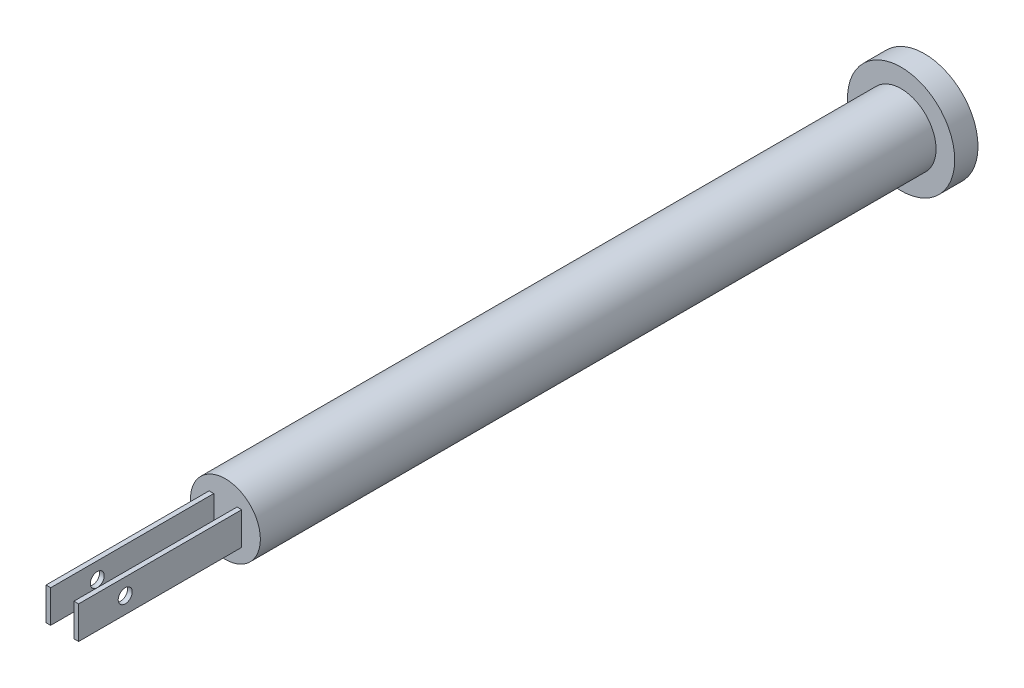
ISO-10303-21;
HEADER;
FILE_DESCRIPTION(('STEP AP214'),'2;1');
FILE_NAME('part.step','',(''),(''),'','','');
FILE_SCHEMA(('AUTOMOTIVE_DESIGN { 1 0 10303 214 1 1 1 1 }'));
ENDSEC;
DATA;
#1=APPLICATION_CONTEXT('core data for automotive mechanical design processes');
#2=APPLICATION_PROTOCOL_DEFINITION('international standard','automotive_design',2000,#1);
#3=PRODUCT_CONTEXT('',#1,'mechanical');
#4=PRODUCT('Part','Part','',(#3));
#5=PRODUCT_RELATED_PRODUCT_CATEGORY('part','',(#4));
#6=PRODUCT_DEFINITION_FORMATION('','',#4);
#7=PRODUCT_DEFINITION_CONTEXT('part definition',#1,'design');
#8=PRODUCT_DEFINITION('design','',#6,#7);
#9=PRODUCT_DEFINITION_SHAPE('','',#8);
#10=(LENGTH_UNIT() NAMED_UNIT(*) SI_UNIT(.MILLI.,.METRE.));
#11=(NAMED_UNIT(*) PLANE_ANGLE_UNIT() SI_UNIT($,.RADIAN.));
#12=(NAMED_UNIT(*) SI_UNIT($,.STERADIAN.) SOLID_ANGLE_UNIT());
#13=UNCERTAINTY_MEASURE_WITH_UNIT(LENGTH_MEASURE(1.E-05),#10,'distance_accuracy_value','');
#14=(GEOMETRIC_REPRESENTATION_CONTEXT(3) GLOBAL_UNCERTAINTY_ASSIGNED_CONTEXT((#13)) GLOBAL_UNIT_ASSIGNED_CONTEXT((#10,
#11,#12)) REPRESENTATION_CONTEXT('',''));
#15=CARTESIAN_POINT('',(0.,0.,0.));
#16=DIRECTION('',(0.,0.,1.));
#17=DIRECTION('',(1.,0.,0.));
#18=AXIS2_PLACEMENT_3D('',#15,#16,#17);
#19=CARTESIAN_POINT('',(-3.5,3.5,185.));
#20=DIRECTION('',(0.,-1.,0.));
#21=DIRECTION('',(0.,0.,-1.));
#22=AXIS2_PLACEMENT_3D('',#19,#20,#21);
#23=PLANE('',#22);
#24=DIRECTION('',(-1.,0.,0.));
#25=VECTOR('',#24,1.);
#26=CARTESIAN_POINT('',(-3.5,3.5,185.));
#27=LINE('',#26,#25);
#28=CARTESIAN_POINT('',(-2.5,3.5,185.));
#29=VERTEX_POINT('',#28);
#30=CARTESIAN_POINT('',(-3.5,3.5,185.));
#31=VERTEX_POINT('',#30);
#32=EDGE_CURVE('E116',#29,#31,#27,.T.);
#33=ORIENTED_EDGE('',*,*,#32,.F.);
#34=DIRECTION('',(0.,0.,1.));
#35=VECTOR('',#34,1.);
#36=CARTESIAN_POINT('',(-2.50000000000001,3.5,150.));
#37=LINE('',#36,#35);
#38=CARTESIAN_POINT('',(-2.50000000000001,3.5,150.));
#39=VERTEX_POINT('',#38);
#40=EDGE_CURVE('E102',#39,#29,#37,.T.);
#41=ORIENTED_EDGE('',*,*,#40,.F.);
#42=DIRECTION('',(-1.,0.,0.));
#43=VECTOR('',#42,1.);
#44=CARTESIAN_POINT('',(-3.5,3.5,150.));
#45=LINE('',#44,#43);
#46=CARTESIAN_POINT('',(-3.5,3.5,150.));
#47=VERTEX_POINT('',#46);
#48=EDGE_CURVE('E139',#39,#47,#45,.T.);
#49=ORIENTED_EDGE('',*,*,#48,.T.);
#50=DIRECTION('',(0.,0.,-1.));
#51=VECTOR('',#50,1.);
#52=CARTESIAN_POINT('',(-3.5,3.5,185.));
#53=LINE('',#52,#51);
#54=EDGE_CURVE('E120',#31,#47,#53,.T.);
#55=ORIENTED_EDGE('',*,*,#54,.F.);
#56=EDGE_LOOP('',(#33,#41,#49,#55));
#57=FACE_BOUND('',#56,.T.);
#58=ADVANCED_FACE('F35',(#57),#23,.F.);
#59=CARTESIAN_POINT('',(-3.5,-3.5,185.));
#60=DIRECTION('',(0.,1.,0.));
#61=DIRECTION('',(0.,0.,1.));
#62=AXIS2_PLACEMENT_3D('',#59,#60,#61);
#63=PLANE('',#62);
#64=DIRECTION('',(1.,0.,0.));
#65=VECTOR('',#64,1.);
#66=CARTESIAN_POINT('',(-3.5,-3.5,150.));
#67=LINE('',#66,#65);
#68=CARTESIAN_POINT('',(-3.5,-3.5,150.));
#69=VERTEX_POINT('',#68);
#70=CARTESIAN_POINT('',(-2.50000000000001,-3.5,150.));
#71=VERTEX_POINT('',#70);
#72=EDGE_CURVE('E128',#69,#71,#67,.T.);
#73=ORIENTED_EDGE('',*,*,#72,.T.);
#74=DIRECTION('',(0.,0.,1.));
#75=VECTOR('',#74,1.);
#76=CARTESIAN_POINT('',(-2.5,-3.5,185.));
#77=LINE('',#76,#75);
#78=CARTESIAN_POINT('',(-2.5,-3.5,185.));
#79=VERTEX_POINT('',#78);
#80=EDGE_CURVE('E140',#71,#79,#77,.T.);
#81=ORIENTED_EDGE('',*,*,#80,.T.);
#82=DIRECTION('',(1.,0.,0.));
#83=VECTOR('',#82,1.);
#84=CARTESIAN_POINT('',(-3.5,-3.5,185.));
#85=LINE('',#84,#83);
#86=CARTESIAN_POINT('',(-3.5,-3.5,185.));
#87=VERTEX_POINT('',#86);
#88=EDGE_CURVE('E118',#87,#79,#85,.T.);
#89=ORIENTED_EDGE('',*,*,#88,.F.);
#90=DIRECTION('',(0.,0.,-1.));
#91=VECTOR('',#90,1.);
#92=CARTESIAN_POINT('',(-3.5,-3.5,185.));
#93=LINE('',#92,#91);
#94=EDGE_CURVE('E59',#87,#69,#93,.T.);
#95=ORIENTED_EDGE('',*,*,#94,.T.);
#96=EDGE_LOOP('',(#73,#81,#89,#95));
#97=FACE_BOUND('',#96,.T.);
#98=ADVANCED_FACE('F189',(#97),#63,.F.);
#99=CARTESIAN_POINT('',(0.,0.,185.));
#100=DIRECTION('',(0.,0.,-1.));
#101=DIRECTION('',(-1.,0.,0.));
#102=AXIS2_PLACEMENT_3D('',#99,#100,#101);
#103=PLANE('',#102);
#104=ORIENTED_EDGE('',*,*,#88,.T.);
#105=DIRECTION('',(0.,1.,0.));
#106=VECTOR('',#105,1.);
#107=CARTESIAN_POINT('',(-2.5,0.,185.));
#108=LINE('',#107,#106);
#109=EDGE_CURVE('E11',#79,#29,#108,.T.);
#110=ORIENTED_EDGE('',*,*,#109,.T.);
#111=ORIENTED_EDGE('',*,*,#32,.T.);
#112=DIRECTION('',(0.,-1.,0.));
#113=VECTOR('',#112,1.);
#114=CARTESIAN_POINT('',(-3.5,-3.5,185.));
#115=LINE('',#114,#113);
#116=EDGE_CURVE('E126',#31,#87,#115,.T.);
#117=ORIENTED_EDGE('',*,*,#116,.T.);
#118=EDGE_LOOP('',(#104,#110,#111,#117));
#119=FACE_BOUND('',#118,.T.);
#120=ADVANCED_FACE('F115',(#119),#103,.F.);
#121=CARTESIAN_POINT('',(0.,0.,150.));
#122=DIRECTION('',(0.,0.,1.));
#123=DIRECTION('',(1.,0.,0.));
#124=AXIS2_PLACEMENT_3D('',#121,#122,#123);
#125=PLANE('',#124);
#126=CARTESIAN_POINT('',(2.5,-3.5,150.));
#127=VERTEX_POINT('',#126);
#128=CARTESIAN_POINT('',(3.5,-3.5,150.));
#129=VERTEX_POINT('',#128);
#130=EDGE_CURVE('E146',#127,#129,#67,.T.);
#131=ORIENTED_EDGE('',*,*,#130,.F.);
#132=DIRECTION('',(0.,1.,0.));
#133=VECTOR('',#132,1.);
#134=CARTESIAN_POINT('',(2.5,-6.5,150.));
#135=LINE('',#134,#133);
#136=CARTESIAN_POINT('',(2.5,3.5,150.));
#137=VERTEX_POINT('',#136);
#138=EDGE_CURVE('E183',#127,#137,#135,.T.);
#139=ORIENTED_EDGE('',*,*,#138,.T.);
#140=CARTESIAN_POINT('',(3.5,3.5,150.));
#141=VERTEX_POINT('',#140);
#142=EDGE_CURVE('E141',#141,#137,#45,.T.);
#143=ORIENTED_EDGE('',*,*,#142,.F.);
#144=DIRECTION('',(0.,1.,0.));
#145=VECTOR('',#144,1.);
#146=CARTESIAN_POINT('',(3.5,-3.5,150.));
#147=LINE('',#146,#145);
#148=EDGE_CURVE('E136',#129,#141,#147,.T.);
#149=ORIENTED_EDGE('',*,*,#148,.F.);
#150=EDGE_LOOP('',(#131,#139,#143,#149));
#151=FACE_BOUND('',#150,.T.);
#152=DIRECTION('',(0.,1.,0.));
#153=VECTOR('',#152,1.);
#154=CARTESIAN_POINT('',(-2.50000000000001,-6.5,150.));
#155=LINE('',#154,#153);
#156=EDGE_CURVE('E106',#71,#39,#155,.T.);
#157=ORIENTED_EDGE('',*,*,#156,.F.);
#158=ORIENTED_EDGE('',*,*,#72,.F.);
#159=DIRECTION('',(0.,-1.,0.));
#160=VECTOR('',#159,1.);
#161=CARTESIAN_POINT('',(-3.5,-3.5,150.));
#162=LINE('',#161,#160);
#163=EDGE_CURVE('E144',#47,#69,#162,.T.);
#164=ORIENTED_EDGE('',*,*,#163,.F.);
#165=ORIENTED_EDGE('',*,*,#48,.F.);
#166=EDGE_LOOP('',(#157,#158,#164,#165));
#167=FACE_BOUND('',#166,.T.);
#168=CARTESIAN_POINT('',(0.,0.,150.));
#169=DIRECTION('',(0.,0.,1.));
#170=DIRECTION('',(1.,0.,0.));
#171=AXIS2_PLACEMENT_3D('',#168,#169,#170);
#172=CIRCLE('',#171,7.5);
#173=CARTESIAN_POINT('',(7.5,0.,150.));
#174=VERTEX_POINT('',#173);
#175=EDGE_CURVE('E161',#174,#174,#172,.T.);
#176=ORIENTED_EDGE('',*,*,#175,.T.);
#177=EDGE_LOOP('',(#176));
#178=FACE_BOUND('',#177,.T.);
#179=ADVANCED_FACE('F192',(#151,#167,#178),#125,.T.);
#180=CARTESIAN_POINT('',(0.,0.,150.));
#181=DIRECTION('',(0.,0.,-1.));
#182=DIRECTION('',(-1.,0.,0.));
#183=AXIS2_PLACEMENT_3D('',#180,#181,#182);
#184=CYLINDRICAL_SURFACE('',#183,7.5);
#185=CARTESIAN_POINT('',(0.,0.,5.));
#186=DIRECTION('',(0.,0.,1.));
#187=DIRECTION('',(1.,0.,0.));
#188=AXIS2_PLACEMENT_3D('',#185,#186,#187);
#189=CIRCLE('',#188,7.5);
#190=CARTESIAN_POINT('',(7.5,0.,5.));
#191=VERTEX_POINT('',#190);
#192=EDGE_CURVE('E154',#191,#191,#189,.T.);
#193=ORIENTED_EDGE('',*,*,#192,.T.);
#194=EDGE_LOOP('',(#193));
#195=FACE_BOUND('',#194,.T.);
#196=ORIENTED_EDGE('',*,*,#175,.F.);
#197=EDGE_LOOP('',(#196));
#198=FACE_BOUND('',#197,.T.);
#199=ADVANCED_FACE('F37',(#195,#198),#184,.T.);
#200=CARTESIAN_POINT('',(0.,0.,5.));
#201=DIRECTION('',(0.,0.,1.));
#202=DIRECTION('',(1.,0.,0.));
#203=AXIS2_PLACEMENT_3D('',#200,#201,#202);
#204=PLANE('',#203);
#205=CARTESIAN_POINT('',(0.,0.,5.));
#206=DIRECTION('',(0.,0.,1.));
#207=DIRECTION('',(1.,0.,0.));
#208=AXIS2_PLACEMENT_3D('',#205,#206,#207);
#209=CIRCLE('',#208,11.5);
#210=CARTESIAN_POINT('',(11.5,0.,5.));
#211=VERTEX_POINT('',#210);
#212=EDGE_CURVE('E158',#211,#211,#209,.T.);
#213=ORIENTED_EDGE('',*,*,#212,.T.);
#214=EDGE_LOOP('',(#213));
#215=FACE_BOUND('',#214,.T.);
#216=ORIENTED_EDGE('',*,*,#192,.F.);
#217=EDGE_LOOP('',(#216));
#218=FACE_BOUND('',#217,.T.);
#219=ADVANCED_FACE('F216',(#215,#218),#204,.T.);
#220=CARTESIAN_POINT('',(0.,0.,5.));
#221=DIRECTION('',(0.,0.,-1.));
#222=DIRECTION('',(-1.,0.,0.));
#223=AXIS2_PLACEMENT_3D('',#220,#221,#222);
#224=CYLINDRICAL_SURFACE('',#223,11.5);
#225=ORIENTED_EDGE('',*,*,#212,.F.);
#226=EDGE_LOOP('',(#225));
#227=FACE_BOUND('',#226,.T.);
#228=CARTESIAN_POINT('',(0.,0.,0.));
#229=DIRECTION('',(0.,0.,1.));
#230=DIRECTION('',(1.,0.,0.));
#231=AXIS2_PLACEMENT_3D('',#228,#229,#230);
#232=CIRCLE('',#231,11.5);
#233=CARTESIAN_POINT('',(11.5,0.,0.));
#234=VERTEX_POINT('',#233);
#235=EDGE_CURVE('E157',#234,#234,#232,.T.);
#236=ORIENTED_EDGE('',*,*,#235,.T.);
#237=EDGE_LOOP('',(#236));
#238=FACE_BOUND('',#237,.T.);
#239=ADVANCED_FACE('F219',(#227,#238),#224,.T.);
#240=CARTESIAN_POINT('',(0.,0.,0.));
#241=DIRECTION('',(0.,0.,1.));
#242=DIRECTION('',(1.,0.,0.));
#243=AXIS2_PLACEMENT_3D('',#240,#241,#242);
#244=PLANE('',#243);
#245=ORIENTED_EDGE('',*,*,#235,.F.);
#246=EDGE_LOOP('',(#245));
#247=FACE_BOUND('',#246,.T.);
#248=ADVANCED_FACE('F214',(#247),#244,.F.);
#249=CARTESIAN_POINT('',(3.5,-3.5,185.));
#250=DIRECTION('',(-1.,0.,0.));
#251=DIRECTION('',(0.,0.,1.));
#252=AXIS2_PLACEMENT_3D('',#249,#250,#251);
#253=PLANE('',#252);
#254=CARTESIAN_POINT('',(3.5,0.,175.));
#255=DIRECTION('',(1.,0.,0.));
#256=DIRECTION('',(0.,0.,-1.));
#257=AXIS2_PLACEMENT_3D('',#254,#255,#256);
#258=CIRCLE('',#257,1.50000000000003);
#259=CARTESIAN_POINT('',(3.5,0.,173.5));
#260=VERTEX_POINT('',#259);
#261=EDGE_CURVE('E361',#260,#260,#258,.T.);
#262=ORIENTED_EDGE('',*,*,#261,.F.);
#263=EDGE_LOOP('',(#262));
#264=FACE_BOUND('',#263,.T.);
#265=ORIENTED_EDGE('',*,*,#148,.T.);
#266=DIRECTION('',(0.,0.,-1.));
#267=VECTOR('',#266,1.);
#268=CARTESIAN_POINT('',(3.5,3.5,185.));
#269=LINE('',#268,#267);
#270=CARTESIAN_POINT('',(3.5,3.5,185.));
#271=VERTEX_POINT('',#270);
#272=EDGE_CURVE('E152',#271,#141,#269,.T.);
#273=ORIENTED_EDGE('',*,*,#272,.F.);
#274=DIRECTION('',(0.,1.,0.));
#275=VECTOR('',#274,1.);
#276=CARTESIAN_POINT('',(3.5,-3.5,185.));
#277=LINE('',#276,#275);
#278=CARTESIAN_POINT('',(3.5,-3.5,185.));
#279=VERTEX_POINT('',#278);
#280=EDGE_CURVE('E123',#279,#271,#277,.T.);
#281=ORIENTED_EDGE('',*,*,#280,.F.);
#282=DIRECTION('',(0.,0.,-1.));
#283=VECTOR('',#282,1.);
#284=CARTESIAN_POINT('',(3.5,-3.5,185.));
#285=LINE('',#284,#283);
#286=EDGE_CURVE('E135',#279,#129,#285,.T.);
#287=ORIENTED_EDGE('',*,*,#286,.T.);
#288=EDGE_LOOP('',(#265,#273,#281,#287));
#289=FACE_BOUND('',#288,.T.);
#290=ADVANCED_FACE('F179',(#264,#289),#253,.F.);
#291=ORIENTED_EDGE('',*,*,#142,.T.);
#292=DIRECTION('',(0.,0.,-1.));
#293=VECTOR('',#292,1.);
#294=CARTESIAN_POINT('',(2.5,3.5,150.));
#295=LINE('',#294,#293);
#296=CARTESIAN_POINT('',(2.5,3.5,185.));
#297=VERTEX_POINT('',#296);
#298=EDGE_CURVE('E110',#297,#137,#295,.T.);
#299=ORIENTED_EDGE('',*,*,#298,.F.);
#300=EDGE_CURVE('E122',#271,#297,#27,.T.);
#301=ORIENTED_EDGE('',*,*,#300,.F.);
#302=ORIENTED_EDGE('',*,*,#272,.T.);
#303=EDGE_LOOP('',(#291,#299,#301,#302));
#304=FACE_BOUND('',#303,.T.);
#305=ADVANCED_FACE('F182',(#304),#23,.F.);
#306=CARTESIAN_POINT('',(-3.5,-3.5,185.));
#307=DIRECTION('',(1.,0.,0.));
#308=DIRECTION('',(0.,0.,-1.));
#309=AXIS2_PLACEMENT_3D('',#306,#307,#308);
#310=PLANE('',#309);
#311=CARTESIAN_POINT('',(-3.5,0.,175.));
#312=DIRECTION('',(1.,0.,0.));
#313=DIRECTION('',(0.,0.,-1.));
#314=AXIS2_PLACEMENT_3D('',#311,#312,#313);
#315=CIRCLE('',#314,1.50000000000003);
#316=CARTESIAN_POINT('',(-3.5,0.,173.5));
#317=VERTEX_POINT('',#316);
#318=EDGE_CURVE('E111',#317,#317,#315,.T.);
#319=ORIENTED_EDGE('',*,*,#318,.T.);
#320=EDGE_LOOP('',(#319));
#321=FACE_BOUND('',#320,.T.);
#322=ORIENTED_EDGE('',*,*,#163,.T.);
#323=ORIENTED_EDGE('',*,*,#94,.F.);
#324=ORIENTED_EDGE('',*,*,#116,.F.);
#325=ORIENTED_EDGE('',*,*,#54,.T.);
#326=EDGE_LOOP('',(#322,#323,#324,#325));
#327=FACE_BOUND('',#326,.T.);
#328=ADVANCED_FACE('F196',(#321,#327),#310,.F.);
#329=CARTESIAN_POINT('',(2.5,-3.5,185.));
#330=VERTEX_POINT('',#329);
#331=EDGE_CURVE('E133',#330,#279,#85,.T.);
#332=ORIENTED_EDGE('',*,*,#331,.F.);
#333=DIRECTION('',(0.,0.,-1.));
#334=VECTOR('',#333,1.);
#335=CARTESIAN_POINT('',(2.5,-3.5,185.));
#336=LINE('',#335,#334);
#337=EDGE_CURVE('E51',#330,#127,#336,.T.);
#338=ORIENTED_EDGE('',*,*,#337,.T.);
#339=ORIENTED_EDGE('',*,*,#130,.T.);
#340=ORIENTED_EDGE('',*,*,#286,.F.);
#341=EDGE_LOOP('',(#332,#338,#339,#340));
#342=FACE_BOUND('',#341,.T.);
#343=ADVANCED_FACE('F173',(#342),#63,.F.);
#344=ORIENTED_EDGE('',*,*,#300,.T.);
#345=DIRECTION('',(0.,-1.,0.));
#346=VECTOR('',#345,1.);
#347=CARTESIAN_POINT('',(2.5,0.,185.));
#348=LINE('',#347,#346);
#349=EDGE_CURVE('E44',#297,#330,#348,.T.);
#350=ORIENTED_EDGE('',*,*,#349,.T.);
#351=ORIENTED_EDGE('',*,*,#331,.T.);
#352=ORIENTED_EDGE('',*,*,#280,.T.);
#353=EDGE_LOOP('',(#344,#350,#351,#352));
#354=FACE_BOUND('',#353,.T.);
#355=ADVANCED_FACE('F168',(#354),#103,.F.);
#356=CARTESIAN_POINT('',(-2.50000000000001,-6.5,150.));
#357=DIRECTION('',(-1.,0.,0.));
#358=DIRECTION('',(0.,0.,1.));
#359=AXIS2_PLACEMENT_3D('',#356,#357,#358);
#360=PLANE('',#359);
#361=CARTESIAN_POINT('',(-2.5,0.,175.));
#362=DIRECTION('',(-1.,0.,0.));
#363=DIRECTION('',(0.,0.,1.));
#364=AXIS2_PLACEMENT_3D('',#361,#362,#363);
#365=CIRCLE('',#364,1.50000000000003);
#366=CARTESIAN_POINT('',(-2.5,0.,176.5));
#367=VERTEX_POINT('',#366);
#368=EDGE_CURVE('E357',#367,#367,#365,.T.);
#369=ORIENTED_EDGE('',*,*,#368,.T.);
#370=EDGE_LOOP('',(#369));
#371=FACE_BOUND('',#370,.T.);
#372=ORIENTED_EDGE('',*,*,#156,.T.);
#373=ORIENTED_EDGE('',*,*,#40,.T.);
#374=ORIENTED_EDGE('',*,*,#109,.F.);
#375=ORIENTED_EDGE('',*,*,#80,.F.);
#376=EDGE_LOOP('',(#372,#373,#374,#375));
#377=FACE_BOUND('',#376,.T.);
#378=ADVANCED_FACE('F103',(#371,#377),#360,.F.);
#379=CARTESIAN_POINT('',(2.5,-6.5,150.));
#380=DIRECTION('',(1.,0.,0.));
#381=DIRECTION('',(0.,0.,-1.));
#382=AXIS2_PLACEMENT_3D('',#379,#380,#381);
#383=PLANE('',#382);
#384=CARTESIAN_POINT('',(2.5,0.,175.));
#385=DIRECTION('',(1.,0.,0.));
#386=DIRECTION('',(0.,0.,-1.));
#387=AXIS2_PLACEMENT_3D('',#384,#385,#386);
#388=CIRCLE('',#387,1.50000000000003);
#389=CARTESIAN_POINT('',(2.5,0.,173.5));
#390=VERTEX_POINT('',#389);
#391=EDGE_CURVE('E39',#390,#390,#388,.T.);
#392=ORIENTED_EDGE('',*,*,#391,.T.);
#393=EDGE_LOOP('',(#392));
#394=FACE_BOUND('',#393,.T.);
#395=ORIENTED_EDGE('',*,*,#349,.F.);
#396=ORIENTED_EDGE('',*,*,#298,.T.);
#397=ORIENTED_EDGE('',*,*,#138,.F.);
#398=ORIENTED_EDGE('',*,*,#337,.F.);
#399=EDGE_LOOP('',(#395,#396,#397,#398));
#400=FACE_BOUND('',#399,.T.);
#401=ADVANCED_FACE('F270',(#394,#400),#383,.F.);
#402=CARTESIAN_POINT('',(-6.5,0.,175.));
#403=DIRECTION('',(1.,0.,0.));
#404=DIRECTION('',(0.,0.,-1.));
#405=AXIS2_PLACEMENT_3D('',#402,#403,#404);
#406=CYLINDRICAL_SURFACE('',#405,1.50000000000003);
#407=ORIENTED_EDGE('',*,*,#261,.T.);
#408=EDGE_LOOP('',(#407));
#409=FACE_BOUND('',#408,.T.);
#410=ORIENTED_EDGE('',*,*,#391,.F.);
#411=EDGE_LOOP('',(#410));
#412=FACE_BOUND('',#411,.T.);
#413=ADVANCED_FACE('F278',(#409,#412),#406,.F.);
#414=ORIENTED_EDGE('',*,*,#368,.F.);
#415=EDGE_LOOP('',(#414));
#416=FACE_BOUND('',#415,.T.);
#417=ORIENTED_EDGE('',*,*,#318,.F.);
#418=EDGE_LOOP('',(#417));
#419=FACE_BOUND('',#418,.T.);
#420=ADVANCED_FACE('F286',(#416,#419),#406,.F.);
#421=CLOSED_SHELL('',(#58,#98,#120,#179,#199,#219,#239,#248,#290,#305,#328,#343,#355,#378,#401,
#413,#420));
#422=MANIFOLD_SOLID_BREP('B2',#421);
#423=ADVANCED_BREP_SHAPE_REPRESENTATION('',(#18,#422),#14);
#424=SHAPE_DEFINITION_REPRESENTATION(#9,#423);
ENDSEC;
END-ISO-10303-21;
